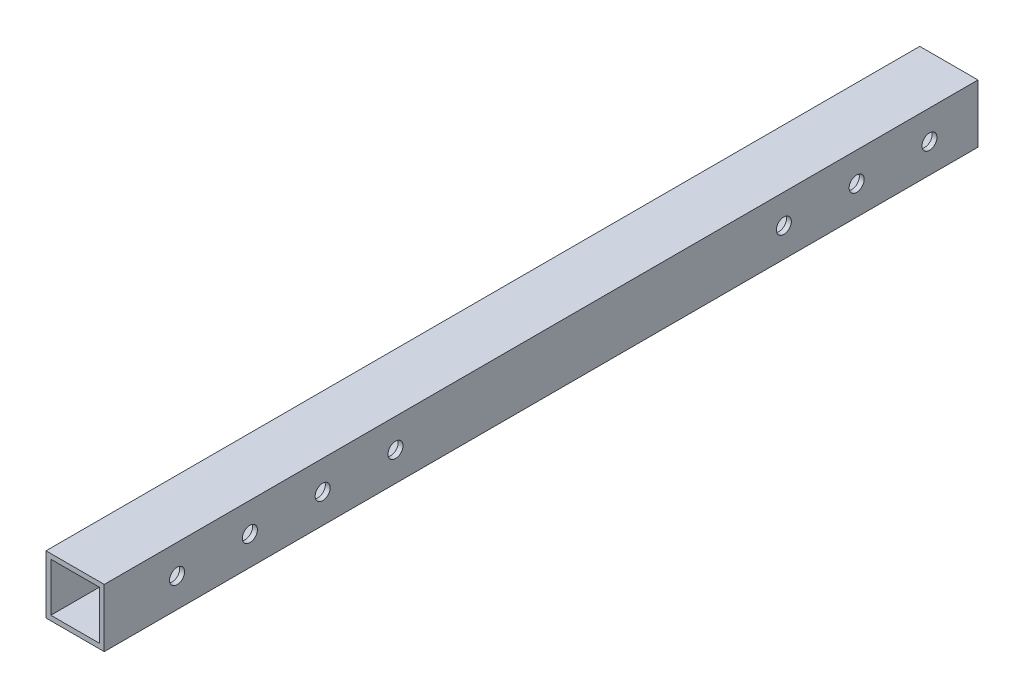
ISO-10303-21;
HEADER;
FILE_DESCRIPTION(('STEP AP214'),'2;1');
FILE_NAME('part.step','',(''),(''),'','','');
FILE_SCHEMA(('AUTOMOTIVE_DESIGN { 1 0 10303 214 1 1 1 1 }'));
ENDSEC;
DATA;
#1=APPLICATION_CONTEXT('core data for automotive mechanical design processes');
#2=APPLICATION_PROTOCOL_DEFINITION('international standard','automotive_design',2000,#1);
#3=PRODUCT_CONTEXT('',#1,'mechanical');
#4=PRODUCT('Part','Part','',(#3));
#5=PRODUCT_RELATED_PRODUCT_CATEGORY('part','',(#4));
#6=PRODUCT_DEFINITION_FORMATION('','',#4);
#7=PRODUCT_DEFINITION_CONTEXT('part definition',#1,'design');
#8=PRODUCT_DEFINITION('design','',#6,#7);
#9=PRODUCT_DEFINITION_SHAPE('','',#8);
#10=(LENGTH_UNIT() NAMED_UNIT(*) SI_UNIT(.MILLI.,.METRE.));
#11=(NAMED_UNIT(*) PLANE_ANGLE_UNIT() SI_UNIT($,.RADIAN.));
#12=(NAMED_UNIT(*) SI_UNIT($,.STERADIAN.) SOLID_ANGLE_UNIT());
#13=UNCERTAINTY_MEASURE_WITH_UNIT(LENGTH_MEASURE(1.E-05),#10,'distance_accuracy_value','');
#14=(GEOMETRIC_REPRESENTATION_CONTEXT(3) GLOBAL_UNCERTAINTY_ASSIGNED_CONTEXT((#13)) GLOBAL_UNIT_ASSIGNED_CONTEXT((#10,
#11,#12)) REPRESENTATION_CONTEXT('',''));
#15=CARTESIAN_POINT('',(0.,0.,0.));
#16=DIRECTION('',(0.,0.,1.));
#17=DIRECTION('',(1.,0.,0.));
#18=AXIS2_PLACEMENT_3D('',#15,#16,#17);
#19=CARTESIAN_POINT('',(0.,0.,-180.));
#20=DIRECTION('',(0.,0.,1.));
#21=DIRECTION('',(-1.,0.,0.));
#22=AXIS2_PLACEMENT_3D('',#19,#20,#21);
#23=PLANE('',#22);
#24=DIRECTION('',(0.,-1.,0.));
#25=VECTOR('',#24,1.);
#26=CARTESIAN_POINT('',(0.,0.,-180.));
#27=LINE('',#26,#25);
#28=CARTESIAN_POINT('',(0.,12.,-180.));
#29=VERTEX_POINT('',#28);
#30=CARTESIAN_POINT('',(0.,0.,-180.));
#31=VERTEX_POINT('',#30);
#32=EDGE_CURVE('E166',#29,#31,#27,.T.);
#33=ORIENTED_EDGE('',*,*,#32,.F.);
#34=DIRECTION('',(-1.,0.,0.));
#35=VECTOR('',#34,1.);
#36=CARTESIAN_POINT('',(0.,12.,-180.));
#37=LINE('',#36,#35);
#38=CARTESIAN_POINT('',(12.,12.,-180.));
#39=VERTEX_POINT('',#38);
#40=EDGE_CURVE('E179',#39,#29,#37,.T.);
#41=ORIENTED_EDGE('',*,*,#40,.F.);
#42=DIRECTION('',(0.,1.,0.));
#43=VECTOR('',#42,1.);
#44=CARTESIAN_POINT('',(12.,0.,-180.));
#45=LINE('',#44,#43);
#46=CARTESIAN_POINT('',(12.,0.,-180.));
#47=VERTEX_POINT('',#46);
#48=EDGE_CURVE('E175',#47,#39,#45,.T.);
#49=ORIENTED_EDGE('',*,*,#48,.F.);
#50=DIRECTION('',(1.,0.,0.));
#51=VECTOR('',#50,1.);
#52=CARTESIAN_POINT('',(0.,0.,-180.));
#53=LINE('',#52,#51);
#54=EDGE_CURVE('E170',#31,#47,#53,.T.);
#55=ORIENTED_EDGE('',*,*,#54,.F.);
#56=EDGE_LOOP('',(#33,#41,#49,#55));
#57=FACE_BOUND('',#56,.T.);
#58=DIRECTION('',(1.,0.,0.));
#59=VECTOR('',#58,1.);
#60=CARTESIAN_POINT('',(1.,1.,-180.));
#61=LINE('',#60,#59);
#62=CARTESIAN_POINT('',(1.,1.,-180.));
#63=VERTEX_POINT('',#62);
#64=CARTESIAN_POINT('',(11.,1.,-180.));
#65=VERTEX_POINT('',#64);
#66=EDGE_CURVE('E117',#63,#65,#61,.T.);
#67=ORIENTED_EDGE('',*,*,#66,.T.);
#68=DIRECTION('',(0.,1.,0.));
#69=VECTOR('',#68,1.);
#70=CARTESIAN_POINT('',(11.,1.,-180.));
#71=LINE('',#70,#69);
#72=CARTESIAN_POINT('',(11.,11.,-180.));
#73=VERTEX_POINT('',#72);
#74=EDGE_CURVE('E127',#65,#73,#71,.T.);
#75=ORIENTED_EDGE('',*,*,#74,.T.);
#76=DIRECTION('',(-1.,0.,0.));
#77=VECTOR('',#76,1.);
#78=CARTESIAN_POINT('',(1.,11.,-180.));
#79=LINE('',#78,#77);
#80=CARTESIAN_POINT('',(1.,11.,-180.));
#81=VERTEX_POINT('',#80);
#82=EDGE_CURVE('E132',#73,#81,#79,.T.);
#83=ORIENTED_EDGE('',*,*,#82,.T.);
#84=DIRECTION('',(0.,-1.,0.));
#85=VECTOR('',#84,1.);
#86=CARTESIAN_POINT('',(1.,1.,-180.));
#87=LINE('',#86,#85);
#88=EDGE_CURVE('E135',#81,#63,#87,.T.);
#89=ORIENTED_EDGE('',*,*,#88,.T.);
#90=EDGE_LOOP('',(#67,#75,#83,#89));
#91=FACE_BOUND('',#90,.T.);
#92=ADVANCED_FACE('F47',(#57,#91),#23,.F.);
#93=CARTESIAN_POINT('',(0.,0.,0.));
#94=DIRECTION('',(0.,0.,1.));
#95=DIRECTION('',(-1.,0.,0.));
#96=AXIS2_PLACEMENT_3D('',#93,#94,#95);
#97=PLANE('',#96);
#98=DIRECTION('',(0.,-1.,0.));
#99=VECTOR('',#98,1.);
#100=CARTESIAN_POINT('',(0.,0.,0.));
#101=LINE('',#100,#99);
#102=CARTESIAN_POINT('',(0.,12.,0.));
#103=VERTEX_POINT('',#102);
#104=CARTESIAN_POINT('',(0.,0.,0.));
#105=VERTEX_POINT('',#104);
#106=EDGE_CURVE('E123',#103,#105,#101,.T.);
#107=ORIENTED_EDGE('',*,*,#106,.T.);
#108=DIRECTION('',(1.,0.,0.));
#109=VECTOR('',#108,1.);
#110=CARTESIAN_POINT('',(0.,0.,0.));
#111=LINE('',#110,#109);
#112=CARTESIAN_POINT('',(12.,0.,0.));
#113=VERTEX_POINT('',#112);
#114=EDGE_CURVE('E187',#105,#113,#111,.T.);
#115=ORIENTED_EDGE('',*,*,#114,.T.);
#116=DIRECTION('',(0.,1.,0.));
#117=VECTOR('',#116,1.);
#118=CARTESIAN_POINT('',(12.,0.,0.));
#119=LINE('',#118,#117);
#120=CARTESIAN_POINT('',(12.,12.,0.));
#121=VERTEX_POINT('',#120);
#122=EDGE_CURVE('E191',#113,#121,#119,.T.);
#123=ORIENTED_EDGE('',*,*,#122,.T.);
#124=DIRECTION('',(-1.,0.,0.));
#125=VECTOR('',#124,1.);
#126=CARTESIAN_POINT('',(0.,12.,0.));
#127=LINE('',#126,#125);
#128=EDGE_CURVE('E171',#121,#103,#127,.T.);
#129=ORIENTED_EDGE('',*,*,#128,.T.);
#130=EDGE_LOOP('',(#107,#115,#123,#129));
#131=FACE_BOUND('',#130,.T.);
#132=DIRECTION('',(0.,-1.,0.));
#133=VECTOR('',#132,1.);
#134=CARTESIAN_POINT('',(1.,1.,0.));
#135=LINE('',#134,#133);
#136=CARTESIAN_POINT('',(1.,11.,0.));
#137=VERTEX_POINT('',#136);
#138=CARTESIAN_POINT('',(1.,1.,0.));
#139=VERTEX_POINT('',#138);
#140=EDGE_CURVE('E137',#137,#139,#135,.T.);
#141=ORIENTED_EDGE('',*,*,#140,.F.);
#142=DIRECTION('',(-1.,0.,0.));
#143=VECTOR('',#142,1.);
#144=CARTESIAN_POINT('',(1.,11.,0.));
#145=LINE('',#144,#143);
#146=CARTESIAN_POINT('',(11.,11.,0.));
#147=VERTEX_POINT('',#146);
#148=EDGE_CURVE('E143',#147,#137,#145,.T.);
#149=ORIENTED_EDGE('',*,*,#148,.F.);
#150=DIRECTION('',(0.,1.,0.));
#151=VECTOR('',#150,1.);
#152=CARTESIAN_POINT('',(11.,1.,0.));
#153=LINE('',#152,#151);
#154=CARTESIAN_POINT('',(11.,1.,0.));
#155=VERTEX_POINT('',#154);
#156=EDGE_CURVE('E155',#155,#147,#153,.T.);
#157=ORIENTED_EDGE('',*,*,#156,.F.);
#158=DIRECTION('',(1.,0.,0.));
#159=VECTOR('',#158,1.);
#160=CARTESIAN_POINT('',(1.,1.,0.));
#161=LINE('',#160,#159);
#162=EDGE_CURVE('E118',#139,#155,#161,.T.);
#163=ORIENTED_EDGE('',*,*,#162,.F.);
#164=EDGE_LOOP('',(#141,#149,#157,#163));
#165=FACE_BOUND('',#164,.T.);
#166=ADVANCED_FACE('F336',(#131,#165),#97,.T.);
#167=CARTESIAN_POINT('',(0.,0.,-180.));
#168=DIRECTION('',(1.,0.,0.));
#169=DIRECTION('',(0.,0.,1.));
#170=AXIS2_PLACEMENT_3D('',#167,#168,#169);
#171=PLANE('',#170);
#172=CARTESIAN_POINT('',(0.,6.,-170.));
#173=DIRECTION('',(-1.,0.,0.));
#174=DIRECTION('',(0.,0.,1.));
#175=AXIS2_PLACEMENT_3D('',#172,#173,#174);
#176=CIRCLE('',#175,1.55);
#177=CARTESIAN_POINT('',(0.,6.,-168.45));
#178=VERTEX_POINT('',#177);
#179=EDGE_CURVE('E278',#178,#178,#176,.T.);
#180=ORIENTED_EDGE('',*,*,#179,.F.);
#181=EDGE_LOOP('',(#180));
#182=FACE_BOUND('',#181,.T.);
#183=CARTESIAN_POINT('',(0.,6.,-15.));
#184=DIRECTION('',(-1.,0.,0.));
#185=DIRECTION('',(0.,0.,1.));
#186=AXIS2_PLACEMENT_3D('',#183,#184,#185);
#187=CIRCLE('',#186,1.55);
#188=CARTESIAN_POINT('',(0.,6.,-13.45));
#189=VERTEX_POINT('',#188);
#190=EDGE_CURVE('E287',#189,#189,#187,.T.);
#191=ORIENTED_EDGE('',*,*,#190,.F.);
#192=EDGE_LOOP('',(#191));
#193=FACE_BOUND('',#192,.T.);
#194=CARTESIAN_POINT('',(0.,6.,-60.));
#195=DIRECTION('',(-1.,0.,0.));
#196=DIRECTION('',(0.,0.,1.));
#197=AXIS2_PLACEMENT_3D('',#194,#195,#196);
#198=CIRCLE('',#197,1.55);
#199=CARTESIAN_POINT('',(0.,6.,-58.45));
#200=VERTEX_POINT('',#199);
#201=EDGE_CURVE('E263',#200,#200,#198,.T.);
#202=ORIENTED_EDGE('',*,*,#201,.F.);
#203=EDGE_LOOP('',(#202));
#204=FACE_BOUND('',#203,.T.);
#205=CARTESIAN_POINT('',(0.,6.,-45.));
#206=DIRECTION('',(-1.,0.,0.));
#207=DIRECTION('',(0.,0.,1.));
#208=AXIS2_PLACEMENT_3D('',#205,#206,#207);
#209=CIRCLE('',#208,1.55);
#210=CARTESIAN_POINT('',(0.,6.,-43.45));
#211=VERTEX_POINT('',#210);
#212=EDGE_CURVE('E271',#211,#211,#209,.T.);
#213=ORIENTED_EDGE('',*,*,#212,.F.);
#214=EDGE_LOOP('',(#213));
#215=FACE_BOUND('',#214,.T.);
#216=CARTESIAN_POINT('',(0.,6.,-155.));
#217=DIRECTION('',(-1.,0.,0.));
#218=DIRECTION('',(0.,0.,1.));
#219=AXIS2_PLACEMENT_3D('',#216,#217,#218);
#220=CIRCLE('',#219,1.55);
#221=CARTESIAN_POINT('',(0.,6.,-153.45));
#222=VERTEX_POINT('',#221);
#223=EDGE_CURVE('E302',#222,#222,#220,.T.);
#224=ORIENTED_EDGE('',*,*,#223,.F.);
#225=EDGE_LOOP('',(#224));
#226=FACE_BOUND('',#225,.T.);
#227=CARTESIAN_POINT('',(0.,6.,-140.));
#228=DIRECTION('',(-1.,0.,0.));
#229=DIRECTION('',(0.,0.,1.));
#230=AXIS2_PLACEMENT_3D('',#227,#228,#229);
#231=CIRCLE('',#230,1.55);
#232=CARTESIAN_POINT('',(0.,6.,-138.45));
#233=VERTEX_POINT('',#232);
#234=EDGE_CURVE('E294',#233,#233,#231,.T.);
#235=ORIENTED_EDGE('',*,*,#234,.F.);
#236=EDGE_LOOP('',(#235));
#237=FACE_BOUND('',#236,.T.);
#238=CARTESIAN_POINT('',(0.,6.,-30.));
#239=DIRECTION('',(-1.,0.,0.));
#240=DIRECTION('',(0.,0.,1.));
#241=AXIS2_PLACEMENT_3D('',#238,#239,#240);
#242=CIRCLE('',#241,1.55);
#243=CARTESIAN_POINT('',(0.,6.,-28.45));
#244=VERTEX_POINT('',#243);
#245=EDGE_CURVE('E210',#244,#244,#242,.T.);
#246=ORIENTED_EDGE('',*,*,#245,.F.);
#247=EDGE_LOOP('',(#246));
#248=FACE_BOUND('',#247,.T.);
#249=ORIENTED_EDGE('',*,*,#106,.F.);
#250=DIRECTION('',(0.,0.,1.));
#251=VECTOR('',#250,1.);
#252=CARTESIAN_POINT('',(0.,12.,-180.));
#253=LINE('',#252,#251);
#254=EDGE_CURVE('E183',#29,#103,#253,.T.);
#255=ORIENTED_EDGE('',*,*,#254,.F.);
#256=ORIENTED_EDGE('',*,*,#32,.T.);
#257=DIRECTION('',(0.,0.,1.));
#258=VECTOR('',#257,1.);
#259=CARTESIAN_POINT('',(0.,0.,-180.));
#260=LINE('',#259,#258);
#261=EDGE_CURVE('E11',#31,#105,#260,.T.);
#262=ORIENTED_EDGE('',*,*,#261,.T.);
#263=EDGE_LOOP('',(#249,#255,#256,#262));
#264=FACE_BOUND('',#263,.T.);
#265=ADVANCED_FACE('F49',(#182,#193,#204,#215,#226,#237,#248,#264),#171,.F.);
#266=CARTESIAN_POINT('',(0.,0.,-180.));
#267=DIRECTION('',(0.,1.,0.));
#268=DIRECTION('',(0.,0.,-1.));
#269=AXIS2_PLACEMENT_3D('',#266,#267,#268);
#270=PLANE('',#269);
#271=ORIENTED_EDGE('',*,*,#114,.F.);
#272=ORIENTED_EDGE('',*,*,#261,.F.);
#273=ORIENTED_EDGE('',*,*,#54,.T.);
#274=DIRECTION('',(0.,0.,1.));
#275=VECTOR('',#274,1.);
#276=CARTESIAN_POINT('',(12.,0.,-180.));
#277=LINE('',#276,#275);
#278=EDGE_CURVE('E57',#47,#113,#277,.T.);
#279=ORIENTED_EDGE('',*,*,#278,.T.);
#280=EDGE_LOOP('',(#271,#272,#273,#279));
#281=FACE_BOUND('',#280,.T.);
#282=ADVANCED_FACE('F353',(#281),#270,.F.);
#283=CARTESIAN_POINT('',(12.,0.,-180.));
#284=DIRECTION('',(-1.,0.,0.));
#285=DIRECTION('',(0.,0.,-1.));
#286=AXIS2_PLACEMENT_3D('',#283,#284,#285);
#287=PLANE('',#286);
#288=CARTESIAN_POINT('',(12.,6.,-170.));
#289=DIRECTION('',(-1.,0.,0.));
#290=DIRECTION('',(0.,0.,1.));
#291=AXIS2_PLACEMENT_3D('',#288,#289,#290);
#292=CIRCLE('',#291,1.55);
#293=CARTESIAN_POINT('',(12.,6.,-168.45));
#294=VERTEX_POINT('',#293);
#295=EDGE_CURVE('E282',#294,#294,#292,.T.);
#296=ORIENTED_EDGE('',*,*,#295,.T.);
#297=EDGE_LOOP('',(#296));
#298=FACE_BOUND('',#297,.T.);
#299=CARTESIAN_POINT('',(12.,6.,-15.));
#300=DIRECTION('',(-1.,0.,0.));
#301=DIRECTION('',(0.,0.,1.));
#302=AXIS2_PLACEMENT_3D('',#299,#300,#301);
#303=CIRCLE('',#302,1.55);
#304=CARTESIAN_POINT('',(12.,6.,-13.45));
#305=VERTEX_POINT('',#304);
#306=EDGE_CURVE('E267',#305,#305,#303,.T.);
#307=ORIENTED_EDGE('',*,*,#306,.T.);
#308=EDGE_LOOP('',(#307));
#309=FACE_BOUND('',#308,.T.);
#310=CARTESIAN_POINT('',(12.,6.,-60.));
#311=DIRECTION('',(-1.,0.,0.));
#312=DIRECTION('',(0.,0.,1.));
#313=AXIS2_PLACEMENT_3D('',#310,#311,#312);
#314=CIRCLE('',#313,1.55);
#315=CARTESIAN_POINT('',(12.,6.,-58.45));
#316=VERTEX_POINT('',#315);
#317=EDGE_CURVE('E266',#316,#316,#314,.T.);
#318=ORIENTED_EDGE('',*,*,#317,.T.);
#319=EDGE_LOOP('',(#318));
#320=FACE_BOUND('',#319,.T.);
#321=CARTESIAN_POINT('',(12.,6.,-45.));
#322=DIRECTION('',(-1.,0.,0.));
#323=DIRECTION('',(0.,0.,1.));
#324=AXIS2_PLACEMENT_3D('',#321,#322,#323);
#325=CIRCLE('',#324,1.55);
#326=CARTESIAN_POINT('',(12.,6.,-43.45));
#327=VERTEX_POINT('',#326);
#328=EDGE_CURVE('E260',#327,#327,#325,.T.);
#329=ORIENTED_EDGE('',*,*,#328,.T.);
#330=EDGE_LOOP('',(#329));
#331=FACE_BOUND('',#330,.T.);
#332=CARTESIAN_POINT('',(12.,6.,-155.));
#333=DIRECTION('',(-1.,0.,0.));
#334=DIRECTION('',(0.,0.,1.));
#335=AXIS2_PLACEMENT_3D('',#332,#333,#334);
#336=CIRCLE('',#335,1.55);
#337=CARTESIAN_POINT('',(12.,6.,-153.45));
#338=VERTEX_POINT('',#337);
#339=EDGE_CURVE('E283',#338,#338,#336,.T.);
#340=ORIENTED_EDGE('',*,*,#339,.T.);
#341=EDGE_LOOP('',(#340));
#342=FACE_BOUND('',#341,.T.);
#343=CARTESIAN_POINT('',(12.,6.,-140.));
#344=DIRECTION('',(-1.,0.,0.));
#345=DIRECTION('',(0.,0.,1.));
#346=AXIS2_PLACEMENT_3D('',#343,#344,#345);
#347=CIRCLE('',#346,1.55);
#348=CARTESIAN_POINT('',(12.,6.,-138.45));
#349=VERTEX_POINT('',#348);
#350=EDGE_CURVE('E298',#349,#349,#347,.T.);
#351=ORIENTED_EDGE('',*,*,#350,.T.);
#352=EDGE_LOOP('',(#351));
#353=FACE_BOUND('',#352,.T.);
#354=CARTESIAN_POINT('',(12.,6.,-30.));
#355=DIRECTION('',(-1.,0.,0.));
#356=DIRECTION('',(0.,0.,1.));
#357=AXIS2_PLACEMENT_3D('',#354,#355,#356);
#358=CIRCLE('',#357,1.55);
#359=CARTESIAN_POINT('',(12.,6.,-28.45));
#360=VERTEX_POINT('',#359);
#361=EDGE_CURVE('E256',#360,#360,#358,.T.);
#362=ORIENTED_EDGE('',*,*,#361,.T.);
#363=EDGE_LOOP('',(#362));
#364=FACE_BOUND('',#363,.T.);
#365=ORIENTED_EDGE('',*,*,#122,.F.);
#366=ORIENTED_EDGE('',*,*,#278,.F.);
#367=ORIENTED_EDGE('',*,*,#48,.T.);
#368=DIRECTION('',(0.,0.,1.));
#369=VECTOR('',#368,1.);
#370=CARTESIAN_POINT('',(12.,12.,-180.));
#371=LINE('',#370,#369);
#372=EDGE_CURVE('E200',#39,#121,#371,.T.);
#373=ORIENTED_EDGE('',*,*,#372,.T.);
#374=EDGE_LOOP('',(#365,#366,#367,#373));
#375=FACE_BOUND('',#374,.T.);
#376=ADVANCED_FACE('F310',(#298,#309,#320,#331,#342,#353,#364,#375),#287,.F.);
#377=CARTESIAN_POINT('',(0.,12.,-180.));
#378=DIRECTION('',(0.,-1.,0.));
#379=DIRECTION('',(0.,0.,1.));
#380=AXIS2_PLACEMENT_3D('',#377,#378,#379);
#381=PLANE('',#380);
#382=ORIENTED_EDGE('',*,*,#128,.F.);
#383=ORIENTED_EDGE('',*,*,#372,.F.);
#384=ORIENTED_EDGE('',*,*,#40,.T.);
#385=ORIENTED_EDGE('',*,*,#254,.T.);
#386=EDGE_LOOP('',(#382,#383,#384,#385));
#387=FACE_BOUND('',#386,.T.);
#388=ADVANCED_FACE('F348',(#387),#381,.F.);
#389=CARTESIAN_POINT('',(1.,1.,-180.));
#390=DIRECTION('',(0.,1.,0.));
#391=DIRECTION('',(0.,0.,-1.));
#392=AXIS2_PLACEMENT_3D('',#389,#390,#391);
#393=PLANE('',#392);
#394=ORIENTED_EDGE('',*,*,#162,.T.);
#395=DIRECTION('',(0.,0.,1.));
#396=VECTOR('',#395,1.);
#397=CARTESIAN_POINT('',(11.,1.,-180.));
#398=LINE('',#397,#396);
#399=EDGE_CURVE('E113',#65,#155,#398,.T.);
#400=ORIENTED_EDGE('',*,*,#399,.F.);
#401=ORIENTED_EDGE('',*,*,#66,.F.);
#402=DIRECTION('',(0.,0.,1.));
#403=VECTOR('',#402,1.);
#404=CARTESIAN_POINT('',(1.,1.,-180.));
#405=LINE('',#404,#403);
#406=EDGE_CURVE('E73',#63,#139,#405,.T.);
#407=ORIENTED_EDGE('',*,*,#406,.T.);
#408=EDGE_LOOP('',(#394,#400,#401,#407));
#409=FACE_BOUND('',#408,.T.);
#410=ADVANCED_FACE('F115',(#409),#393,.T.);
#411=CARTESIAN_POINT('',(11.,1.,-180.));
#412=DIRECTION('',(-1.,0.,0.));
#413=DIRECTION('',(0.,0.,-1.));
#414=AXIS2_PLACEMENT_3D('',#411,#412,#413);
#415=PLANE('',#414);
#416=CARTESIAN_POINT('',(11.,6.,-170.));
#417=DIRECTION('',(1.,0.,0.));
#418=DIRECTION('',(0.,0.,-1.));
#419=AXIS2_PLACEMENT_3D('',#416,#417,#418);
#420=CIRCLE('',#419,1.55);
#421=CARTESIAN_POINT('',(11.,6.,-171.55));
#422=VERTEX_POINT('',#421);
#423=EDGE_CURVE('E146',#422,#422,#420,.T.);
#424=ORIENTED_EDGE('',*,*,#423,.T.);
#425=EDGE_LOOP('',(#424));
#426=FACE_BOUND('',#425,.T.);
#427=CARTESIAN_POINT('',(11.,6.,-15.));
#428=DIRECTION('',(1.,0.,0.));
#429=DIRECTION('',(0.,0.,-1.));
#430=AXIS2_PLACEMENT_3D('',#427,#428,#429);
#431=CIRCLE('',#430,1.55);
#432=CARTESIAN_POINT('',(11.,6.,-16.55));
#433=VERTEX_POINT('',#432);
#434=EDGE_CURVE('E233',#433,#433,#431,.T.);
#435=ORIENTED_EDGE('',*,*,#434,.T.);
#436=EDGE_LOOP('',(#435));
#437=FACE_BOUND('',#436,.T.);
#438=CARTESIAN_POINT('',(11.,6.,-60.));
#439=DIRECTION('',(1.,0.,0.));
#440=DIRECTION('',(0.,0.,-1.));
#441=AXIS2_PLACEMENT_3D('',#438,#439,#440);
#442=CIRCLE('',#441,1.55);
#443=CARTESIAN_POINT('',(11.,6.,-61.55));
#444=VERTEX_POINT('',#443);
#445=EDGE_CURVE('E229',#444,#444,#442,.T.);
#446=ORIENTED_EDGE('',*,*,#445,.T.);
#447=EDGE_LOOP('',(#446));
#448=FACE_BOUND('',#447,.T.);
#449=CARTESIAN_POINT('',(11.,6.,-45.));
#450=DIRECTION('',(1.,0.,0.));
#451=DIRECTION('',(0.,0.,-1.));
#452=AXIS2_PLACEMENT_3D('',#449,#450,#451);
#453=CIRCLE('',#452,1.55);
#454=CARTESIAN_POINT('',(11.,6.,-46.55));
#455=VERTEX_POINT('',#454);
#456=EDGE_CURVE('E225',#455,#455,#453,.T.);
#457=ORIENTED_EDGE('',*,*,#456,.T.);
#458=EDGE_LOOP('',(#457));
#459=FACE_BOUND('',#458,.T.);
#460=CARTESIAN_POINT('',(11.,6.,-155.));
#461=DIRECTION('',(1.,0.,0.));
#462=DIRECTION('',(0.,0.,-1.));
#463=AXIS2_PLACEMENT_3D('',#460,#461,#462);
#464=CIRCLE('',#463,1.55);
#465=CARTESIAN_POINT('',(11.,6.,-156.55));
#466=VERTEX_POINT('',#465);
#467=EDGE_CURVE('E220',#466,#466,#464,.T.);
#468=ORIENTED_EDGE('',*,*,#467,.T.);
#469=EDGE_LOOP('',(#468));
#470=FACE_BOUND('',#469,.T.);
#471=CARTESIAN_POINT('',(11.,6.,-140.));
#472=DIRECTION('',(1.,0.,0.));
#473=DIRECTION('',(0.,0.,-1.));
#474=AXIS2_PLACEMENT_3D('',#471,#472,#473);
#475=CIRCLE('',#474,1.55);
#476=CARTESIAN_POINT('',(11.,6.,-141.55));
#477=VERTEX_POINT('',#476);
#478=EDGE_CURVE('E215',#477,#477,#475,.T.);
#479=ORIENTED_EDGE('',*,*,#478,.T.);
#480=EDGE_LOOP('',(#479));
#481=FACE_BOUND('',#480,.T.);
#482=CARTESIAN_POINT('',(11.,6.,-30.));
#483=DIRECTION('',(1.,0.,0.));
#484=DIRECTION('',(0.,0.,-1.));
#485=AXIS2_PLACEMENT_3D('',#482,#483,#484);
#486=CIRCLE('',#485,1.55);
#487=CARTESIAN_POINT('',(11.,6.,-31.55));
#488=VERTEX_POINT('',#487);
#489=EDGE_CURVE('E209',#488,#488,#486,.T.);
#490=ORIENTED_EDGE('',*,*,#489,.T.);
#491=EDGE_LOOP('',(#490));
#492=FACE_BOUND('',#491,.T.);
#493=ORIENTED_EDGE('',*,*,#156,.T.);
#494=DIRECTION('',(0.,0.,1.));
#495=VECTOR('',#494,1.);
#496=CARTESIAN_POINT('',(11.,11.,-180.));
#497=LINE('',#496,#495);
#498=EDGE_CURVE('E124',#73,#147,#497,.T.);
#499=ORIENTED_EDGE('',*,*,#498,.F.);
#500=ORIENTED_EDGE('',*,*,#74,.F.);
#501=ORIENTED_EDGE('',*,*,#399,.T.);
#502=EDGE_LOOP('',(#493,#499,#500,#501));
#503=FACE_BOUND('',#502,.T.);
#504=ADVANCED_FACE('F128',(#426,#437,#448,#459,#470,#481,#492,#503),#415,.T.);
#505=CARTESIAN_POINT('',(1.,11.,-180.));
#506=DIRECTION('',(0.,-1.,0.));
#507=DIRECTION('',(0.,0.,1.));
#508=AXIS2_PLACEMENT_3D('',#505,#506,#507);
#509=PLANE('',#508);
#510=ORIENTED_EDGE('',*,*,#148,.T.);
#511=DIRECTION('',(0.,0.,1.));
#512=VECTOR('',#511,1.);
#513=CARTESIAN_POINT('',(1.,11.,-180.));
#514=LINE('',#513,#512);
#515=EDGE_CURVE('E65',#81,#137,#514,.T.);
#516=ORIENTED_EDGE('',*,*,#515,.F.);
#517=ORIENTED_EDGE('',*,*,#82,.F.);
#518=ORIENTED_EDGE('',*,*,#498,.T.);
#519=EDGE_LOOP('',(#510,#516,#517,#518));
#520=FACE_BOUND('',#519,.T.);
#521=ADVANCED_FACE('F375',(#520),#509,.T.);
#522=CARTESIAN_POINT('',(1.,1.,-180.));
#523=DIRECTION('',(1.,0.,0.));
#524=DIRECTION('',(0.,0.,1.));
#525=AXIS2_PLACEMENT_3D('',#522,#523,#524);
#526=PLANE('',#525);
#527=CARTESIAN_POINT('',(1.,6.,-170.));
#528=DIRECTION('',(-1.,0.,0.));
#529=DIRECTION('',(0.,0.,1.));
#530=AXIS2_PLACEMENT_3D('',#527,#528,#529);
#531=CIRCLE('',#530,1.55);
#532=CARTESIAN_POINT('',(1.,6.,-168.45));
#533=VERTEX_POINT('',#532);
#534=EDGE_CURVE('E51',#533,#533,#531,.T.);
#535=ORIENTED_EDGE('',*,*,#534,.T.);
#536=EDGE_LOOP('',(#535));
#537=FACE_BOUND('',#536,.T.);
#538=CARTESIAN_POINT('',(1.,6.,-15.));
#539=DIRECTION('',(-1.,0.,0.));
#540=DIRECTION('',(0.,0.,1.));
#541=AXIS2_PLACEMENT_3D('',#538,#539,#540);
#542=CIRCLE('',#541,1.55);
#543=CARTESIAN_POINT('',(1.,6.,-13.45));
#544=VERTEX_POINT('',#543);
#545=EDGE_CURVE('E230',#544,#544,#542,.T.);
#546=ORIENTED_EDGE('',*,*,#545,.T.);
#547=EDGE_LOOP('',(#546));
#548=FACE_BOUND('',#547,.T.);
#549=CARTESIAN_POINT('',(1.,6.,-60.));
#550=DIRECTION('',(-1.,0.,0.));
#551=DIRECTION('',(0.,0.,1.));
#552=AXIS2_PLACEMENT_3D('',#549,#550,#551);
#553=CIRCLE('',#552,1.55);
#554=CARTESIAN_POINT('',(1.,6.,-58.45));
#555=VERTEX_POINT('',#554);
#556=EDGE_CURVE('E226',#555,#555,#553,.T.);
#557=ORIENTED_EDGE('',*,*,#556,.T.);
#558=EDGE_LOOP('',(#557));
#559=FACE_BOUND('',#558,.T.);
#560=CARTESIAN_POINT('',(1.,6.,-45.));
#561=DIRECTION('',(-1.,0.,0.));
#562=DIRECTION('',(0.,0.,1.));
#563=AXIS2_PLACEMENT_3D('',#560,#561,#562);
#564=CIRCLE('',#563,1.55);
#565=CARTESIAN_POINT('',(1.,6.,-43.45));
#566=VERTEX_POINT('',#565);
#567=EDGE_CURVE('E221',#566,#566,#564,.T.);
#568=ORIENTED_EDGE('',*,*,#567,.T.);
#569=EDGE_LOOP('',(#568));
#570=FACE_BOUND('',#569,.T.);
#571=CARTESIAN_POINT('',(1.,6.,-155.));
#572=DIRECTION('',(-1.,0.,0.));
#573=DIRECTION('',(0.,0.,1.));
#574=AXIS2_PLACEMENT_3D('',#571,#572,#573);
#575=CIRCLE('',#574,1.55);
#576=CARTESIAN_POINT('',(1.,6.,-153.45));
#577=VERTEX_POINT('',#576);
#578=EDGE_CURVE('E216',#577,#577,#575,.T.);
#579=ORIENTED_EDGE('',*,*,#578,.T.);
#580=EDGE_LOOP('',(#579));
#581=FACE_BOUND('',#580,.T.);
#582=CARTESIAN_POINT('',(1.,6.,-140.));
#583=DIRECTION('',(-1.,0.,0.));
#584=DIRECTION('',(0.,0.,1.));
#585=AXIS2_PLACEMENT_3D('',#582,#583,#584);
#586=CIRCLE('',#585,1.55);
#587=CARTESIAN_POINT('',(1.,6.,-138.45));
#588=VERTEX_POINT('',#587);
#589=EDGE_CURVE('E211',#588,#588,#586,.T.);
#590=ORIENTED_EDGE('',*,*,#589,.T.);
#591=EDGE_LOOP('',(#590));
#592=FACE_BOUND('',#591,.T.);
#593=CARTESIAN_POINT('',(1.,6.,-30.));
#594=DIRECTION('',(-1.,0.,0.));
#595=DIRECTION('',(0.,0.,1.));
#596=AXIS2_PLACEMENT_3D('',#593,#594,#595);
#597=CIRCLE('',#596,1.55);
#598=CARTESIAN_POINT('',(1.,6.,-28.45));
#599=VERTEX_POINT('',#598);
#600=EDGE_CURVE('E205',#599,#599,#597,.T.);
#601=ORIENTED_EDGE('',*,*,#600,.T.);
#602=EDGE_LOOP('',(#601));
#603=FACE_BOUND('',#602,.T.);
#604=ORIENTED_EDGE('',*,*,#140,.T.);
#605=ORIENTED_EDGE('',*,*,#406,.F.);
#606=ORIENTED_EDGE('',*,*,#88,.F.);
#607=ORIENTED_EDGE('',*,*,#515,.T.);
#608=EDGE_LOOP('',(#604,#605,#606,#607));
#609=FACE_BOUND('',#608,.T.);
#610=ADVANCED_FACE('F374',(#537,#548,#559,#570,#581,#592,#603,#609),#526,.T.);
#611=CARTESIAN_POINT('',(0.,6.,-30.));
#612=DIRECTION('',(1.,0.,0.));
#613=DIRECTION('',(0.,0.,1.));
#614=AXIS2_PLACEMENT_3D('',#611,#612,#613);
#615=CYLINDRICAL_SURFACE('',#614,1.55);
#616=ORIENTED_EDGE('',*,*,#600,.F.);
#617=EDGE_LOOP('',(#616));
#618=FACE_BOUND('',#617,.T.);
#619=ORIENTED_EDGE('',*,*,#245,.T.);
#620=EDGE_LOOP('',(#619));
#621=FACE_BOUND('',#620,.T.);
#622=ADVANCED_FACE('F382',(#618,#621),#615,.F.);
#623=CARTESIAN_POINT('',(0.,6.,-140.));
#624=DIRECTION('',(1.,0.,0.));
#625=DIRECTION('',(0.,0.,1.));
#626=AXIS2_PLACEMENT_3D('',#623,#624,#625);
#627=CYLINDRICAL_SURFACE('',#626,1.55);
#628=ORIENTED_EDGE('',*,*,#589,.F.);
#629=EDGE_LOOP('',(#628));
#630=FACE_BOUND('',#629,.T.);
#631=ORIENTED_EDGE('',*,*,#234,.T.);
#632=EDGE_LOOP('',(#631));
#633=FACE_BOUND('',#632,.T.);
#634=ADVANCED_FACE('F331',(#630,#633),#627,.F.);
#635=CARTESIAN_POINT('',(0.,6.,-155.));
#636=DIRECTION('',(1.,0.,0.));
#637=DIRECTION('',(0.,0.,1.));
#638=AXIS2_PLACEMENT_3D('',#635,#636,#637);
#639=CYLINDRICAL_SURFACE('',#638,1.55);
#640=ORIENTED_EDGE('',*,*,#578,.F.);
#641=EDGE_LOOP('',(#640));
#642=FACE_BOUND('',#641,.T.);
#643=ORIENTED_EDGE('',*,*,#223,.T.);
#644=EDGE_LOOP('',(#643));
#645=FACE_BOUND('',#644,.T.);
#646=ADVANCED_FACE('F319',(#642,#645),#639,.F.);
#647=CARTESIAN_POINT('',(0.,6.,-45.));
#648=DIRECTION('',(1.,0.,0.));
#649=DIRECTION('',(0.,0.,1.));
#650=AXIS2_PLACEMENT_3D('',#647,#648,#649);
#651=CYLINDRICAL_SURFACE('',#650,1.55);
#652=ORIENTED_EDGE('',*,*,#567,.F.);
#653=EDGE_LOOP('',(#652));
#654=FACE_BOUND('',#653,.T.);
#655=ORIENTED_EDGE('',*,*,#212,.T.);
#656=EDGE_LOOP('',(#655));
#657=FACE_BOUND('',#656,.T.);
#658=ADVANCED_FACE('F327',(#654,#657),#651,.F.);
#659=CARTESIAN_POINT('',(0.,6.,-60.));
#660=DIRECTION('',(1.,0.,0.));
#661=DIRECTION('',(0.,0.,1.));
#662=AXIS2_PLACEMENT_3D('',#659,#660,#661);
#663=CYLINDRICAL_SURFACE('',#662,1.55);
#664=ORIENTED_EDGE('',*,*,#556,.F.);
#665=EDGE_LOOP('',(#664));
#666=FACE_BOUND('',#665,.T.);
#667=ORIENTED_EDGE('',*,*,#201,.T.);
#668=EDGE_LOOP('',(#667));
#669=FACE_BOUND('',#668,.T.);
#670=ADVANCED_FACE('F390',(#666,#669),#663,.F.);
#671=CARTESIAN_POINT('',(0.,6.,-15.));
#672=DIRECTION('',(1.,0.,0.));
#673=DIRECTION('',(0.,0.,1.));
#674=AXIS2_PLACEMENT_3D('',#671,#672,#673);
#675=CYLINDRICAL_SURFACE('',#674,1.55);
#676=ORIENTED_EDGE('',*,*,#545,.F.);
#677=EDGE_LOOP('',(#676));
#678=FACE_BOUND('',#677,.T.);
#679=ORIENTED_EDGE('',*,*,#190,.T.);
#680=EDGE_LOOP('',(#679));
#681=FACE_BOUND('',#680,.T.);
#682=ADVANCED_FACE('F392',(#678,#681),#675,.F.);
#683=CARTESIAN_POINT('',(0.,6.,-170.));
#684=DIRECTION('',(1.,0.,0.));
#685=DIRECTION('',(0.,0.,1.));
#686=AXIS2_PLACEMENT_3D('',#683,#684,#685);
#687=CYLINDRICAL_SURFACE('',#686,1.55);
#688=ORIENTED_EDGE('',*,*,#534,.F.);
#689=EDGE_LOOP('',(#688));
#690=FACE_BOUND('',#689,.T.);
#691=ORIENTED_EDGE('',*,*,#179,.T.);
#692=EDGE_LOOP('',(#691));
#693=FACE_BOUND('',#692,.T.);
#694=ADVANCED_FACE('F397',(#690,#693),#687,.F.);
#695=ORIENTED_EDGE('',*,*,#489,.F.);
#696=EDGE_LOOP('',(#695));
#697=FACE_BOUND('',#696,.T.);
#698=ORIENTED_EDGE('',*,*,#361,.F.);
#699=EDGE_LOOP('',(#698));
#700=FACE_BOUND('',#699,.T.);
#701=ADVANCED_FACE('F328',(#697,#700),#615,.F.);
#702=ORIENTED_EDGE('',*,*,#478,.F.);
#703=EDGE_LOOP('',(#702));
#704=FACE_BOUND('',#703,.T.);
#705=ORIENTED_EDGE('',*,*,#350,.F.);
#706=EDGE_LOOP('',(#705));
#707=FACE_BOUND('',#706,.T.);
#708=ADVANCED_FACE('F316',(#704,#707),#627,.F.);
#709=ORIENTED_EDGE('',*,*,#467,.F.);
#710=EDGE_LOOP('',(#709));
#711=FACE_BOUND('',#710,.T.);
#712=ORIENTED_EDGE('',*,*,#339,.F.);
#713=EDGE_LOOP('',(#712));
#714=FACE_BOUND('',#713,.T.);
#715=ADVANCED_FACE('F313',(#711,#714),#639,.F.);
#716=ORIENTED_EDGE('',*,*,#456,.F.);
#717=EDGE_LOOP('',(#716));
#718=FACE_BOUND('',#717,.T.);
#719=ORIENTED_EDGE('',*,*,#328,.F.);
#720=EDGE_LOOP('',(#719));
#721=FACE_BOUND('',#720,.T.);
#722=ADVANCED_FACE('F315',(#718,#721),#651,.F.);
#723=ORIENTED_EDGE('',*,*,#445,.F.);
#724=EDGE_LOOP('',(#723));
#725=FACE_BOUND('',#724,.T.);
#726=ORIENTED_EDGE('',*,*,#317,.F.);
#727=EDGE_LOOP('',(#726));
#728=FACE_BOUND('',#727,.T.);
#729=ADVANCED_FACE('F324',(#725,#728),#663,.F.);
#730=ORIENTED_EDGE('',*,*,#434,.F.);
#731=EDGE_LOOP('',(#730));
#732=FACE_BOUND('',#731,.T.);
#733=ORIENTED_EDGE('',*,*,#306,.F.);
#734=EDGE_LOOP('',(#733));
#735=FACE_BOUND('',#734,.T.);
#736=ADVANCED_FACE('F404',(#732,#735),#675,.F.);
#737=ORIENTED_EDGE('',*,*,#423,.F.);
#738=EDGE_LOOP('',(#737));
#739=FACE_BOUND('',#738,.T.);
#740=ORIENTED_EDGE('',*,*,#295,.F.);
#741=EDGE_LOOP('',(#740));
#742=FACE_BOUND('',#741,.T.);
#743=ADVANCED_FACE('F401',(#739,#742),#687,.F.);
#744=CLOSED_SHELL('',(#92,#166,#265,#282,#376,#388,#410,#504,#521,#610,#622,#634,#646,#658,#670,
#682,#694,#701,#708,#715,#722,#729,#736,#743));
#745=MANIFOLD_SOLID_BREP('B2',#744);
#746=ADVANCED_BREP_SHAPE_REPRESENTATION('',(#18,#745),#14);
#747=SHAPE_DEFINITION_REPRESENTATION(#9,#746);
ENDSEC;
END-ISO-10303-21;
